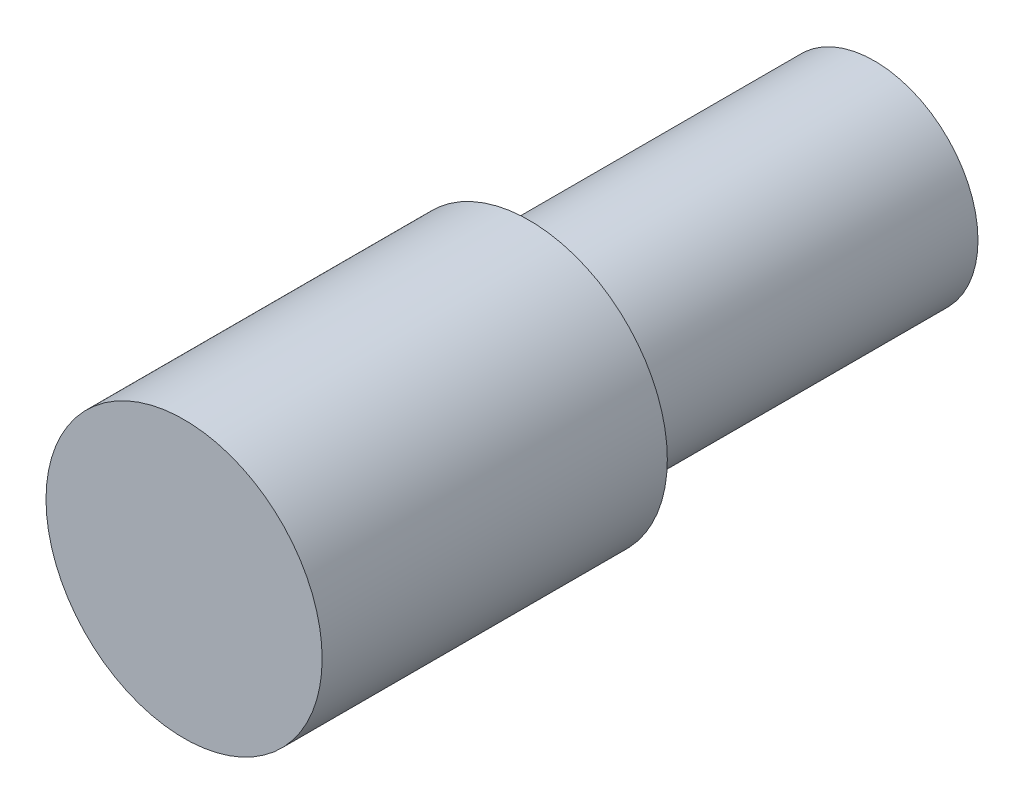
ISO-10303-21;
HEADER;
FILE_DESCRIPTION(('STEP AP214'),'2;1');
FILE_NAME('part.step','',(''),(''),'','','');
FILE_SCHEMA(('AUTOMOTIVE_DESIGN { 1 0 10303 214 1 1 1 1 }'));
ENDSEC;
DATA;
#1=APPLICATION_CONTEXT('core data for automotive mechanical design processes');
#2=APPLICATION_PROTOCOL_DEFINITION('international standard','automotive_design',2000,#1);
#3=PRODUCT_CONTEXT('',#1,'mechanical');
#4=PRODUCT('Part','Part','',(#3));
#5=PRODUCT_RELATED_PRODUCT_CATEGORY('part','',(#4));
#6=PRODUCT_DEFINITION_FORMATION('','',#4);
#7=PRODUCT_DEFINITION_CONTEXT('part definition',#1,'design');
#8=PRODUCT_DEFINITION('design','',#6,#7);
#9=PRODUCT_DEFINITION_SHAPE('','',#8);
#10=(LENGTH_UNIT() NAMED_UNIT(*) SI_UNIT(.MILLI.,.METRE.));
#11=(NAMED_UNIT(*) PLANE_ANGLE_UNIT() SI_UNIT($,.RADIAN.));
#12=(NAMED_UNIT(*) SI_UNIT($,.STERADIAN.) SOLID_ANGLE_UNIT());
#13=UNCERTAINTY_MEASURE_WITH_UNIT(LENGTH_MEASURE(1.E-05),#10,'distance_accuracy_value','');
#14=(GEOMETRIC_REPRESENTATION_CONTEXT(3) GLOBAL_UNCERTAINTY_ASSIGNED_CONTEXT((#13)) GLOBAL_UNIT_ASSIGNED_CONTEXT((#10,
#11,#12)) REPRESENTATION_CONTEXT('',''));
#15=CARTESIAN_POINT('',(0.,0.,0.));
#16=DIRECTION('',(0.,0.,1.));
#17=DIRECTION('',(1.,0.,0.));
#18=AXIS2_PLACEMENT_3D('',#15,#16,#17);
#19=CARTESIAN_POINT('',(0.,0.,5.));
#20=DIRECTION('',(0.,0.,-1.));
#21=DIRECTION('',(-1.,0.,0.));
#22=AXIS2_PLACEMENT_3D('',#19,#20,#21);
#23=CYLINDRICAL_SURFACE('',#22,1.5);
#24=CARTESIAN_POINT('',(0.,0.,5.));
#25=DIRECTION('',(0.,0.,1.));
#26=DIRECTION('',(1.,0.,0.));
#27=AXIS2_PLACEMENT_3D('',#24,#25,#26);
#28=CIRCLE('',#27,1.5);
#29=CARTESIAN_POINT('',(1.5,0.,5.));
#30=VERTEX_POINT('',#29);
#31=EDGE_CURVE('E10',#30,#30,#28,.T.);
#32=ORIENTED_EDGE('',*,*,#31,.F.);
#33=EDGE_LOOP('',(#32));
#34=FACE_BOUND('',#33,.T.);
#35=CARTESIAN_POINT('',(0.,0.,0.));
#36=DIRECTION('',(0.,0.,1.));
#37=DIRECTION('',(1.,0.,0.));
#38=AXIS2_PLACEMENT_3D('',#35,#36,#37);
#39=CIRCLE('',#38,1.5);
#40=CARTESIAN_POINT('',(1.5,0.,0.));
#41=VERTEX_POINT('',#40);
#42=EDGE_CURVE('E46',#41,#41,#39,.T.);
#43=ORIENTED_EDGE('',*,*,#42,.T.);
#44=EDGE_LOOP('',(#43));
#45=FACE_BOUND('',#44,.T.);
#46=ADVANCED_FACE('F43',(#34,#45),#23,.T.);
#47=CARTESIAN_POINT('',(0.,0.,0.));
#48=DIRECTION('',(0.,0.,1.));
#49=DIRECTION('',(1.,0.,0.));
#50=AXIS2_PLACEMENT_3D('',#47,#48,#49);
#51=PLANE('',#50);
#52=ORIENTED_EDGE('',*,*,#42,.F.);
#53=EDGE_LOOP('',(#52));
#54=FACE_BOUND('',#53,.T.);
#55=ADVANCED_FACE('F70',(#54),#51,.F.);
#56=CARTESIAN_POINT('',(0.,0.,10.));
#57=DIRECTION('',(0.,0.,-1.));
#58=DIRECTION('',(-1.,0.,0.));
#59=AXIS2_PLACEMENT_3D('',#56,#57,#58);
#60=CYLINDRICAL_SURFACE('',#59,2.);
#61=CARTESIAN_POINT('',(0.,0.,10.));
#62=DIRECTION('',(0.,0.,1.));
#63=DIRECTION('',(1.,0.,0.));
#64=AXIS2_PLACEMENT_3D('',#61,#62,#63);
#65=CIRCLE('',#64,2.);
#66=CARTESIAN_POINT('',(2.,0.,10.));
#67=VERTEX_POINT('',#66);
#68=EDGE_CURVE('E55',#67,#67,#65,.T.);
#69=ORIENTED_EDGE('',*,*,#68,.F.);
#70=EDGE_LOOP('',(#69));
#71=FACE_BOUND('',#70,.T.);
#72=CARTESIAN_POINT('',(0.,0.,5.));
#73=DIRECTION('',(0.,0.,1.));
#74=DIRECTION('',(1.,0.,0.));
#75=AXIS2_PLACEMENT_3D('',#72,#73,#74);
#76=CIRCLE('',#75,2.);
#77=CARTESIAN_POINT('',(2.,0.,5.));
#78=VERTEX_POINT('',#77);
#79=EDGE_CURVE('E57',#78,#78,#76,.T.);
#80=ORIENTED_EDGE('',*,*,#79,.T.);
#81=EDGE_LOOP('',(#80));
#82=FACE_BOUND('',#81,.T.);
#83=ADVANCED_FACE('F67',(#71,#82),#60,.T.);
#84=CARTESIAN_POINT('',(0.,0.,10.));
#85=DIRECTION('',(0.,0.,1.));
#86=DIRECTION('',(1.,0.,0.));
#87=AXIS2_PLACEMENT_3D('',#84,#85,#86);
#88=PLANE('',#87);
#89=ORIENTED_EDGE('',*,*,#68,.T.);
#90=EDGE_LOOP('',(#89));
#91=FACE_BOUND('',#90,.T.);
#92=ADVANCED_FACE('F65',(#91),#88,.T.);
#93=CARTESIAN_POINT('',(0.,0.,5.));
#94=DIRECTION('',(0.,0.,1.));
#95=DIRECTION('',(1.,0.,0.));
#96=AXIS2_PLACEMENT_3D('',#93,#94,#95);
#97=PLANE('',#96);
#98=ORIENTED_EDGE('',*,*,#31,.T.);
#99=EDGE_LOOP('',(#98));
#100=FACE_BOUND('',#99,.T.);
#101=ORIENTED_EDGE('',*,*,#79,.F.);
#102=EDGE_LOOP('',(#101));
#103=FACE_BOUND('',#102,.T.);
#104=ADVANCED_FACE('F74',(#100,#103),#97,.F.);
#105=CLOSED_SHELL('',(#46,#55,#83,#92,#104));
#106=MANIFOLD_SOLID_BREP('B2',#105);
#107=ADVANCED_BREP_SHAPE_REPRESENTATION('',(#18,#106),#14);
#108=SHAPE_DEFINITION_REPRESENTATION(#9,#107);
ENDSEC;
END-ISO-10303-21;
